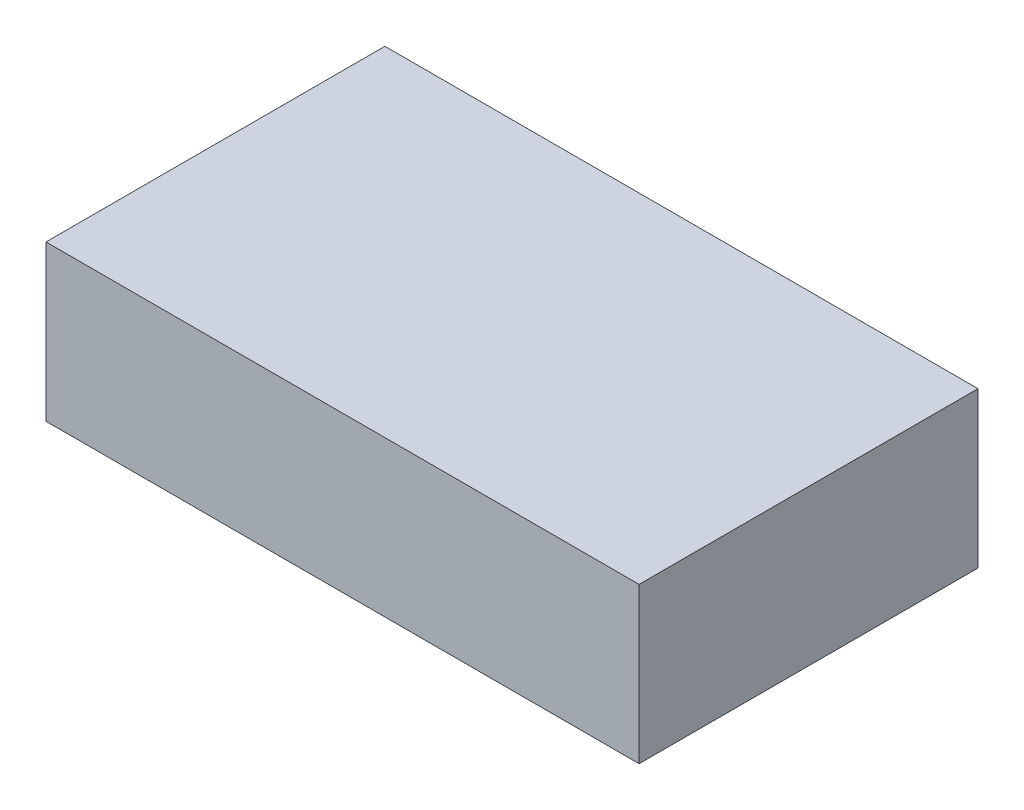
ISO-10303-21;
HEADER;
FILE_DESCRIPTION(('STEP AP214'),'2;1');
FILE_NAME('part.step','',(''),(''),'','','');
FILE_SCHEMA(('AUTOMOTIVE_DESIGN { 1 0 10303 214 1 1 1 1 }'));
ENDSEC;
DATA;
#1=APPLICATION_CONTEXT('core data for automotive mechanical design processes');
#2=APPLICATION_PROTOCOL_DEFINITION('international standard','automotive_design',2000,#1);
#3=PRODUCT_CONTEXT('',#1,'mechanical');
#4=PRODUCT('Part','Part','',(#3));
#5=PRODUCT_RELATED_PRODUCT_CATEGORY('part','',(#4));
#6=PRODUCT_DEFINITION_FORMATION('','',#4);
#7=PRODUCT_DEFINITION_CONTEXT('part definition',#1,'design');
#8=PRODUCT_DEFINITION('design','',#6,#7);
#9=PRODUCT_DEFINITION_SHAPE('','',#8);
#10=(LENGTH_UNIT() NAMED_UNIT(*) SI_UNIT(.MILLI.,.METRE.));
#11=(NAMED_UNIT(*) PLANE_ANGLE_UNIT() SI_UNIT($,.RADIAN.));
#12=(NAMED_UNIT(*) SI_UNIT($,.STERADIAN.) SOLID_ANGLE_UNIT());
#13=UNCERTAINTY_MEASURE_WITH_UNIT(LENGTH_MEASURE(1.E-05),#10,'distance_accuracy_value','');
#14=(GEOMETRIC_REPRESENTATION_CONTEXT(3) GLOBAL_UNCERTAINTY_ASSIGNED_CONTEXT((#13)) GLOBAL_UNIT_ASSIGNED_CONTEXT((#10,
#11,#12)) REPRESENTATION_CONTEXT('',''));
#15=CARTESIAN_POINT('',(0.,0.,0.));
#16=DIRECTION('',(0.,0.,1.));
#17=DIRECTION('',(1.,0.,0.));
#18=AXIS2_PLACEMENT_3D('',#15,#16,#17);
#19=CARTESIAN_POINT('',(0.,11.,0.));
#20=DIRECTION('',(1.,0.,0.));
#21=DIRECTION('',(0.,0.,-1.));
#22=AXIS2_PLACEMENT_3D('',#19,#20,#21);
#23=PLANE('',#22);
#24=DIRECTION('',(0.,0.,1.));
#25=VECTOR('',#24,1.);
#26=CARTESIAN_POINT('',(0.,0.,0.));
#27=LINE('',#26,#25);
#28=CARTESIAN_POINT('',(0.,0.,-24.));
#29=VERTEX_POINT('',#28);
#30=CARTESIAN_POINT('',(0.,0.,0.));
#31=VERTEX_POINT('',#30);
#32=EDGE_CURVE('E102',#29,#31,#27,.T.);
#33=ORIENTED_EDGE('',*,*,#32,.T.);
#34=DIRECTION('',(0.,-1.,0.));
#35=VECTOR('',#34,1.);
#36=CARTESIAN_POINT('',(0.,11.,0.));
#37=LINE('',#36,#35);
#38=CARTESIAN_POINT('',(0.,11.,0.));
#39=VERTEX_POINT('',#38);
#40=EDGE_CURVE('E11',#39,#31,#37,.T.);
#41=ORIENTED_EDGE('',*,*,#40,.F.);
#42=DIRECTION('',(0.,0.,1.));
#43=VECTOR('',#42,1.);
#44=CARTESIAN_POINT('',(0.,11.,0.));
#45=LINE('',#44,#43);
#46=CARTESIAN_POINT('',(0.,11.,-24.));
#47=VERTEX_POINT('',#46);
#48=EDGE_CURVE('E90',#47,#39,#45,.T.);
#49=ORIENTED_EDGE('',*,*,#48,.F.);
#50=DIRECTION('',(0.,-1.,0.));
#51=VECTOR('',#50,1.);
#52=CARTESIAN_POINT('',(0.,11.,-24.));
#53=LINE('',#52,#51);
#54=EDGE_CURVE('E98',#47,#29,#53,.T.);
#55=ORIENTED_EDGE('',*,*,#54,.T.);
#56=EDGE_LOOP('',(#33,#41,#49,#55));
#57=FACE_BOUND('',#56,.T.);
#58=ADVANCED_FACE('F39',(#57),#23,.F.);
#59=CARTESIAN_POINT('',(0.,11.,0.));
#60=DIRECTION('',(0.,0.,-1.));
#61=DIRECTION('',(-1.,0.,0.));
#62=AXIS2_PLACEMENT_3D('',#59,#60,#61);
#63=PLANE('',#62);
#64=DIRECTION('',(1.,0.,0.));
#65=VECTOR('',#64,1.);
#66=CARTESIAN_POINT('',(0.,0.,0.));
#67=LINE('',#66,#65);
#68=CARTESIAN_POINT('',(42.,0.,0.));
#69=VERTEX_POINT('',#68);
#70=EDGE_CURVE('E94',#31,#69,#67,.T.);
#71=ORIENTED_EDGE('',*,*,#70,.T.);
#72=DIRECTION('',(0.,-1.,0.));
#73=VECTOR('',#72,1.);
#74=CARTESIAN_POINT('',(42.,11.,0.));
#75=LINE('',#74,#73);
#76=CARTESIAN_POINT('',(42.,11.,0.));
#77=VERTEX_POINT('',#76);
#78=EDGE_CURVE('E47',#77,#69,#75,.T.);
#79=ORIENTED_EDGE('',*,*,#78,.F.);
#80=DIRECTION('',(1.,0.,0.));
#81=VECTOR('',#80,1.);
#82=CARTESIAN_POINT('',(0.,11.,0.));
#83=LINE('',#82,#81);
#84=EDGE_CURVE('E85',#39,#77,#83,.T.);
#85=ORIENTED_EDGE('',*,*,#84,.F.);
#86=ORIENTED_EDGE('',*,*,#40,.T.);
#87=EDGE_LOOP('',(#71,#79,#85,#86));
#88=FACE_BOUND('',#87,.T.);
#89=ADVANCED_FACE('F93',(#88),#63,.F.);
#90=CARTESIAN_POINT('',(42.,11.,0.));
#91=DIRECTION('',(-1.,0.,0.));
#92=DIRECTION('',(0.,0.,1.));
#93=AXIS2_PLACEMENT_3D('',#90,#91,#92);
#94=PLANE('',#93);
#95=DIRECTION('',(0.,0.,-1.));
#96=VECTOR('',#95,1.);
#97=CARTESIAN_POINT('',(42.,0.,0.));
#98=LINE('',#97,#96);
#99=CARTESIAN_POINT('',(42.,0.,-24.));
#100=VERTEX_POINT('',#99);
#101=EDGE_CURVE('E72',#69,#100,#98,.T.);
#102=ORIENTED_EDGE('',*,*,#101,.T.);
#103=DIRECTION('',(0.,-1.,0.));
#104=VECTOR('',#103,1.);
#105=CARTESIAN_POINT('',(42.,11.,-24.));
#106=LINE('',#105,#104);
#107=CARTESIAN_POINT('',(42.,11.,-24.));
#108=VERTEX_POINT('',#107);
#109=EDGE_CURVE('E95',#108,#100,#106,.T.);
#110=ORIENTED_EDGE('',*,*,#109,.F.);
#111=DIRECTION('',(0.,0.,-1.));
#112=VECTOR('',#111,1.);
#113=CARTESIAN_POINT('',(42.,11.,0.));
#114=LINE('',#113,#112);
#115=EDGE_CURVE('E88',#77,#108,#114,.T.);
#116=ORIENTED_EDGE('',*,*,#115,.F.);
#117=ORIENTED_EDGE('',*,*,#78,.T.);
#118=EDGE_LOOP('',(#102,#110,#116,#117));
#119=FACE_BOUND('',#118,.T.);
#120=ADVANCED_FACE('F96',(#119),#94,.F.);
#121=CARTESIAN_POINT('',(0.,11.,-24.));
#122=DIRECTION('',(0.,0.,1.));
#123=DIRECTION('',(1.,0.,0.));
#124=AXIS2_PLACEMENT_3D('',#121,#122,#123);
#125=PLANE('',#124);
#126=DIRECTION('',(-1.,0.,0.));
#127=VECTOR('',#126,1.);
#128=CARTESIAN_POINT('',(0.,0.,-24.));
#129=LINE('',#128,#127);
#130=EDGE_CURVE('E78',#100,#29,#129,.T.);
#131=ORIENTED_EDGE('',*,*,#130,.T.);
#132=ORIENTED_EDGE('',*,*,#54,.F.);
#133=DIRECTION('',(-1.,0.,0.));
#134=VECTOR('',#133,1.);
#135=CARTESIAN_POINT('',(0.,11.,-24.));
#136=LINE('',#135,#134);
#137=EDGE_CURVE('E55',#108,#47,#136,.T.);
#138=ORIENTED_EDGE('',*,*,#137,.F.);
#139=ORIENTED_EDGE('',*,*,#109,.T.);
#140=EDGE_LOOP('',(#131,#132,#138,#139));
#141=FACE_BOUND('',#140,.T.);
#142=ADVANCED_FACE('F109',(#141),#125,.F.);
#143=CARTESIAN_POINT('',(0.,11.,0.));
#144=DIRECTION('',(0.,-1.,0.));
#145=DIRECTION('',(0.,0.,-1.));
#146=AXIS2_PLACEMENT_3D('',#143,#144,#145);
#147=PLANE('',#146);
#148=ORIENTED_EDGE('',*,*,#48,.T.);
#149=ORIENTED_EDGE('',*,*,#84,.T.);
#150=ORIENTED_EDGE('',*,*,#115,.T.);
#151=ORIENTED_EDGE('',*,*,#137,.T.);
#152=EDGE_LOOP('',(#148,#149,#150,#151));
#153=FACE_BOUND('',#152,.T.);
#154=ADVANCED_FACE('F86',(#153),#147,.F.);
#155=CARTESIAN_POINT('',(0.,0.,0.));
#156=DIRECTION('',(0.,-1.,0.));
#157=DIRECTION('',(0.,0.,-1.));
#158=AXIS2_PLACEMENT_3D('',#155,#156,#157);
#159=PLANE('',#158);
#160=ORIENTED_EDGE('',*,*,#32,.F.);
#161=ORIENTED_EDGE('',*,*,#130,.F.);
#162=ORIENTED_EDGE('',*,*,#101,.F.);
#163=ORIENTED_EDGE('',*,*,#70,.F.);
#164=EDGE_LOOP('',(#160,#161,#162,#163));
#165=FACE_BOUND('',#164,.T.);
#166=ADVANCED_FACE('F112',(#165),#159,.T.);
#167=CLOSED_SHELL('',(#58,#89,#120,#142,#154,#166));
#168=MANIFOLD_SOLID_BREP('B2',#167);
#169=ADVANCED_BREP_SHAPE_REPRESENTATION('',(#18,#168),#14);
#170=SHAPE_DEFINITION_REPRESENTATION(#9,#169);
ENDSEC;
END-ISO-10303-21;
